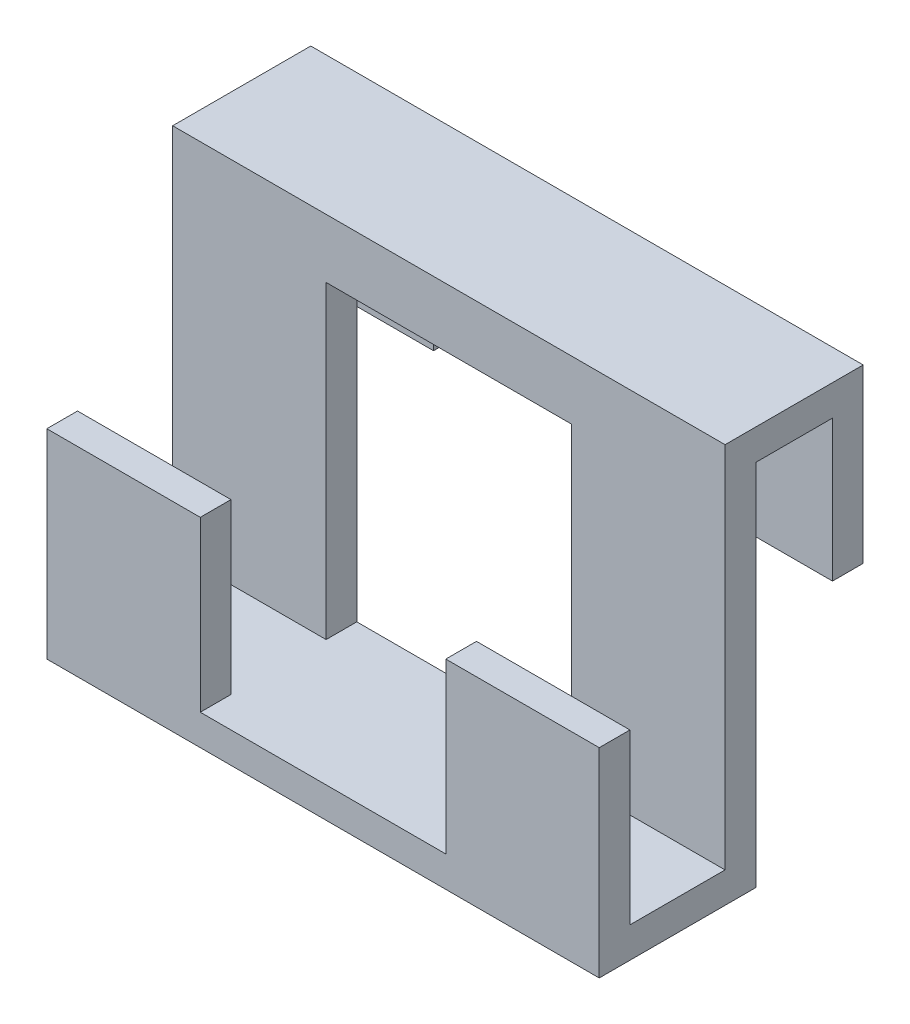
ISO-10303-21;
HEADER;
FILE_DESCRIPTION(('STEP AP214'),'2;1');
FILE_NAME('part.step','',(''),(''),'','','');
FILE_SCHEMA(('AUTOMOTIVE_DESIGN { 1 0 10303 214 1 1 1 1 }'));
ENDSEC;
DATA;
#1=APPLICATION_CONTEXT('core data for automotive mechanical design processes');
#2=APPLICATION_PROTOCOL_DEFINITION('international standard','automotive_design',2000,#1);
#3=PRODUCT_CONTEXT('',#1,'mechanical');
#4=PRODUCT('Part','Part','',(#3));
#5=PRODUCT_RELATED_PRODUCT_CATEGORY('part','',(#4));
#6=PRODUCT_DEFINITION_FORMATION('','',#4);
#7=PRODUCT_DEFINITION_CONTEXT('part definition',#1,'design');
#8=PRODUCT_DEFINITION('design','',#6,#7);
#9=PRODUCT_DEFINITION_SHAPE('','',#8);
#10=(LENGTH_UNIT() NAMED_UNIT(*) SI_UNIT(.MILLI.,.METRE.));
#11=(NAMED_UNIT(*) PLANE_ANGLE_UNIT() SI_UNIT($,.RADIAN.));
#12=(NAMED_UNIT(*) SI_UNIT($,.STERADIAN.) SOLID_ANGLE_UNIT());
#13=UNCERTAINTY_MEASURE_WITH_UNIT(LENGTH_MEASURE(1.E-05),#10,'distance_accuracy_value','');
#14=(GEOMETRIC_REPRESENTATION_CONTEXT(3) GLOBAL_UNCERTAINTY_ASSIGNED_CONTEXT((#13)) GLOBAL_UNIT_ASSIGNED_CONTEXT((#10,
#11,#12)) REPRESENTATION_CONTEXT('',''));
#15=CARTESIAN_POINT('',(0.,0.,0.));
#16=DIRECTION('',(0.,0.,1.));
#17=DIRECTION('',(1.,0.,0.));
#18=AXIS2_PLACEMENT_3D('',#15,#16,#17);
#19=CARTESIAN_POINT('',(180.,-3.93907485343079,0.));
#20=DIRECTION('',(0.,1.,0.));
#21=DIRECTION('',(0.,0.,1.));
#22=AXIS2_PLACEMENT_3D('',#19,#20,#21);
#23=PLANE('',#22);
#24=DIRECTION('',(0.,0.,1.));
#25=VECTOR('',#24,1.);
#26=CARTESIAN_POINT('',(130.,-3.93907485343079,0.));
#27=LINE('',#26,#25);
#28=CARTESIAN_POINT('',(130.,-3.93907485343079,-51.8240956037035));
#29=VERTEX_POINT('',#28);
#30=CARTESIAN_POINT('',(130.,-3.93907485343079,-41.8240956037035));
#31=VERTEX_POINT('',#30);
#32=EDGE_CURVE('E242',#29,#31,#27,.T.);
#33=ORIENTED_EDGE('',*,*,#32,.F.);
#34=DIRECTION('',(-1.,0.,0.));
#35=VECTOR('',#34,1.);
#36=CARTESIAN_POINT('',(180.,-3.93907485343079,-51.8240956037035));
#37=LINE('',#36,#35);
#38=CARTESIAN_POINT('',(180.,-3.93907485343079,-51.8240956037035));
#39=VERTEX_POINT('',#38);
#40=EDGE_CURVE('E353',#39,#29,#37,.T.);
#41=ORIENTED_EDGE('',*,*,#40,.F.);
#42=DIRECTION('',(0.,0.,-1.));
#43=VECTOR('',#42,1.);
#44=CARTESIAN_POINT('',(180.,-3.93907485343079,0.));
#45=LINE('',#44,#43);
#46=CARTESIAN_POINT('',(180.,-3.93907485343079,-41.8240956037035));
#47=VERTEX_POINT('',#46);
#48=EDGE_CURVE('E267',#47,#39,#45,.T.);
#49=ORIENTED_EDGE('',*,*,#48,.F.);
#50=DIRECTION('',(-1.,0.,0.));
#51=VECTOR('',#50,1.);
#52=CARTESIAN_POINT('',(180.,-3.93907485343079,-41.8240956037035));
#53=LINE('',#52,#51);
#54=EDGE_CURVE('E357',#47,#31,#53,.T.);
#55=ORIENTED_EDGE('',*,*,#54,.T.);
#56=EDGE_LOOP('',(#33,#41,#49,#55));
#57=FACE_BOUND('',#56,.T.);
#58=ADVANCED_FACE('F35',(#57),#23,.F.);
#59=CARTESIAN_POINT('',(180.,0.,24.1759043962965));
#60=DIRECTION('',(0.,0.,-1.));
#61=DIRECTION('',(0.,1.,0.));
#62=AXIS2_PLACEMENT_3D('',#59,#60,#61);
#63=PLANE('',#62);
#64=DIRECTION('',(-1.,0.,0.));
#65=VECTOR('',#64,1.);
#66=CARTESIAN_POINT('',(180.,-67.9390748534308,24.1759043962965));
#67=LINE('',#66,#65);
#68=CARTESIAN_POINT('',(180.,-67.9390748534308,24.1759043962965));
#69=VERTEX_POINT('',#68);
#70=CARTESIAN_POINT('',(130.,-67.9390748534308,24.1759043962965));
#71=VERTEX_POINT('',#70);
#72=EDGE_CURVE('E340',#69,#71,#67,.T.);
#73=ORIENTED_EDGE('',*,*,#72,.T.);
#74=DIRECTION('',(0.,1.,0.));
#75=VECTOR('',#74,1.);
#76=CARTESIAN_POINT('',(130.,0.,24.1759043962965));
#77=LINE('',#76,#75);
#78=CARTESIAN_POINT('',(130.,-12.9390748534308,24.1759043962965));
#79=VERTEX_POINT('',#78);
#80=EDGE_CURVE('E202',#71,#79,#77,.T.);
#81=ORIENTED_EDGE('',*,*,#80,.T.);
#82=DIRECTION('',(-1.,0.,0.));
#83=VECTOR('',#82,1.);
#84=CARTESIAN_POINT('',(180.,-12.9390748534308,24.1759043962965));
#85=LINE('',#84,#83);
#86=CARTESIAN_POINT('',(180.,-12.9390748534308,24.1759043962965));
#87=VERTEX_POINT('',#86);
#88=EDGE_CURVE('E336',#87,#79,#85,.T.);
#89=ORIENTED_EDGE('',*,*,#88,.F.);
#90=DIRECTION('',(0.,-1.,0.));
#91=VECTOR('',#90,1.);
#92=CARTESIAN_POINT('',(180.,0.,24.1759043962965));
#93=LINE('',#92,#91);
#94=EDGE_CURVE('E279',#87,#69,#93,.T.);
#95=ORIENTED_EDGE('',*,*,#94,.T.);
#96=EDGE_LOOP('',(#73,#81,#89,#95));
#97=FACE_BOUND('',#96,.T.);
#98=ADVANCED_FACE('F423',(#97),#63,.T.);
#99=CARTESIAN_POINT('',(180.,-12.9390748534308,0.));
#100=DIRECTION('',(0.,1.,0.));
#101=DIRECTION('',(0.,0.,1.));
#102=AXIS2_PLACEMENT_3D('',#99,#100,#101);
#103=PLANE('',#102);
#104=ORIENTED_EDGE('',*,*,#88,.T.);
#105=DIRECTION('',(0.,0.,1.));
#106=VECTOR('',#105,1.);
#107=CARTESIAN_POINT('',(130.,-12.9390748534308,0.));
#108=LINE('',#107,#106);
#109=CARTESIAN_POINT('',(130.,-12.9390748534308,34.1759043962966));
#110=VERTEX_POINT('',#109);
#111=EDGE_CURVE('E233',#79,#110,#108,.T.);
#112=ORIENTED_EDGE('',*,*,#111,.T.);
#113=DIRECTION('',(-1.,0.,0.));
#114=VECTOR('',#113,1.);
#115=CARTESIAN_POINT('',(180.,-12.9390748534308,34.1759043962966));
#116=LINE('',#115,#114);
#117=CARTESIAN_POINT('',(180.,-12.9390748534308,34.1759043962966));
#118=VERTEX_POINT('',#117);
#119=EDGE_CURVE('E219',#118,#110,#116,.T.);
#120=ORIENTED_EDGE('',*,*,#119,.F.);
#121=DIRECTION('',(0.,0.,-1.));
#122=VECTOR('',#121,1.);
#123=CARTESIAN_POINT('',(180.,-12.9390748534308,0.));
#124=LINE('',#123,#122);
#125=EDGE_CURVE('E282',#118,#87,#124,.T.);
#126=ORIENTED_EDGE('',*,*,#125,.T.);
#127=EDGE_LOOP('',(#104,#112,#120,#126));
#128=FACE_BOUND('',#127,.T.);
#129=ADVANCED_FACE('F421',(#128),#103,.T.);
#130=CARTESIAN_POINT('',(180.,0.,-41.8240956037035));
#131=DIRECTION('',(0.,0.,-1.));
#132=DIRECTION('',(0.,1.,0.));
#133=AXIS2_PLACEMENT_3D('',#130,#131,#132);
#134=PLANE('',#133);
#135=CARTESIAN_POINT('',(50.,-3.93907485343079,-41.8240956037035));
#136=VERTEX_POINT('',#135);
#137=CARTESIAN_POINT('',(0.,-3.93907485343079,-41.8240956037035));
#138=VERTEX_POINT('',#137);
#139=EDGE_CURVE('E356',#136,#138,#53,.T.);
#140=ORIENTED_EDGE('',*,*,#139,.F.);
#141=DIRECTION('',(0.,1.,0.));
#142=VECTOR('',#141,1.);
#143=CARTESIAN_POINT('',(50.,0.,-41.8240956037035));
#144=LINE('',#143,#142);
#145=CARTESIAN_POINT('',(50.,32.8455234998181,-41.8240956037035));
#146=VERTEX_POINT('',#145);
#147=EDGE_CURVE('E260',#136,#146,#144,.T.);
#148=ORIENTED_EDGE('',*,*,#147,.T.);
#149=DIRECTION('',(-1.,0.,0.));
#150=VECTOR('',#149,1.);
#151=CARTESIAN_POINT('',(180.,32.8455234998181,-41.8240956037035));
#152=LINE('',#151,#150);
#153=CARTESIAN_POINT('',(130.,32.8455234998181,-41.8240956037035));
#154=VERTEX_POINT('',#153);
#155=EDGE_CURVE('E248',#154,#146,#152,.T.);
#156=ORIENTED_EDGE('',*,*,#155,.F.);
#157=DIRECTION('',(0.,1.,0.));
#158=VECTOR('',#157,1.);
#159=CARTESIAN_POINT('',(130.,0.,-41.8240956037035));
#160=LINE('',#159,#158);
#161=EDGE_CURVE('E244',#31,#154,#160,.T.);
#162=ORIENTED_EDGE('',*,*,#161,.F.);
#163=ORIENTED_EDGE('',*,*,#54,.F.);
#164=DIRECTION('',(0.,-1.,0.));
#165=VECTOR('',#164,1.);
#166=CARTESIAN_POINT('',(180.,0.,-41.8240956037035));
#167=LINE('',#166,#165);
#168=CARTESIAN_POINT('',(180.,42.0609251465692,-41.8240956037035));
#169=VERTEX_POINT('',#168);
#170=EDGE_CURVE('E264',#169,#47,#167,.T.);
#171=ORIENTED_EDGE('',*,*,#170,.F.);
#172=DIRECTION('',(-1.,0.,0.));
#173=VECTOR('',#172,1.);
#174=CARTESIAN_POINT('',(180.,42.0609251465692,-41.8240956037035));
#175=LINE('',#174,#173);
#176=CARTESIAN_POINT('',(0.,42.0609251465692,-41.8240956037035));
#177=VERTEX_POINT('',#176);
#178=EDGE_CURVE('E293',#169,#177,#175,.T.);
#179=ORIENTED_EDGE('',*,*,#178,.T.);
#180=DIRECTION('',(0.,-1.,0.));
#181=VECTOR('',#180,1.);
#182=CARTESIAN_POINT('',(0.,0.,-41.8240956037035));
#183=LINE('',#182,#181);
#184=EDGE_CURVE('E263',#177,#138,#183,.T.);
#185=ORIENTED_EDGE('',*,*,#184,.T.);
#186=EDGE_LOOP('',(#140,#148,#156,#162,#163,#171,#179,#185));
#187=FACE_BOUND('',#186,.T.);
#188=ADVANCED_FACE('F37',(#187),#134,.F.);
#189=CARTESIAN_POINT('',(50.,-3.93907485343079,-51.8240956037035));
#190=VERTEX_POINT('',#189);
#191=CARTESIAN_POINT('',(0.,-3.93907485343079,-51.8240956037035));
#192=VERTEX_POINT('',#191);
#193=EDGE_CURVE('E352',#190,#192,#37,.T.);
#194=ORIENTED_EDGE('',*,*,#193,.F.);
#195=DIRECTION('',(0.,0.,1.));
#196=VECTOR('',#195,1.);
#197=CARTESIAN_POINT('',(50.,-3.93907485343079,0.));
#198=LINE('',#197,#196);
#199=EDGE_CURVE('E257',#190,#136,#198,.T.);
#200=ORIENTED_EDGE('',*,*,#199,.T.);
#201=ORIENTED_EDGE('',*,*,#139,.T.);
#202=DIRECTION('',(0.,0.,-1.));
#203=VECTOR('',#202,1.);
#204=CARTESIAN_POINT('',(0.,-3.93907485343079,0.));
#205=LINE('',#204,#203);
#206=EDGE_CURVE('E296',#138,#192,#205,.T.);
#207=ORIENTED_EDGE('',*,*,#206,.T.);
#208=EDGE_LOOP('',(#194,#200,#201,#207));
#209=FACE_BOUND('',#208,.T.);
#210=ADVANCED_FACE('F441',(#209),#23,.F.);
#211=CARTESIAN_POINT('',(180.,0.,-51.8240956037035));
#212=DIRECTION('',(0.,0.,1.));
#213=DIRECTION('',(1.,0.,0.));
#214=AXIS2_PLACEMENT_3D('',#211,#212,#213);
#215=PLANE('',#214);
#216=DIRECTION('',(1.,0.,0.));
#217=VECTOR('',#216,1.);
#218=CARTESIAN_POINT('',(50.,32.8455234998181,-51.8240956037035));
#219=LINE('',#218,#217);
#220=CARTESIAN_POINT('',(50.,32.8455234998181,-51.8240956037035));
#221=VERTEX_POINT('',#220);
#222=CARTESIAN_POINT('',(130.,32.8455234998181,-51.8240956037035));
#223=VERTEX_POINT('',#222);
#224=EDGE_CURVE('E228',#221,#223,#219,.T.);
#225=ORIENTED_EDGE('',*,*,#224,.F.);
#226=DIRECTION('',(0.,-1.,0.));
#227=VECTOR('',#226,1.);
#228=CARTESIAN_POINT('',(50.,32.8455234998181,-51.8240956037035));
#229=LINE('',#228,#227);
#230=EDGE_CURVE('E220',#221,#190,#229,.T.);
#231=ORIENTED_EDGE('',*,*,#230,.T.);
#232=ORIENTED_EDGE('',*,*,#193,.T.);
#233=DIRECTION('',(0.,1.,0.));
#234=VECTOR('',#233,1.);
#235=CARTESIAN_POINT('',(0.,0.,-51.8240956037035));
#236=LINE('',#235,#234);
#237=CARTESIAN_POINT('',(0.,52.0609251465692,-51.8240956037035));
#238=VERTEX_POINT('',#237);
#239=EDGE_CURVE('E299',#192,#238,#236,.T.);
#240=ORIENTED_EDGE('',*,*,#239,.T.);
#241=DIRECTION('',(-1.,0.,0.));
#242=VECTOR('',#241,1.);
#243=CARTESIAN_POINT('',(180.,52.0609251465692,-51.8240956037035));
#244=LINE('',#243,#242);
#245=CARTESIAN_POINT('',(180.,52.0609251465692,-51.8240956037035));
#246=VERTEX_POINT('',#245);
#247=EDGE_CURVE('E349',#246,#238,#244,.T.);
#248=ORIENTED_EDGE('',*,*,#247,.F.);
#249=DIRECTION('',(0.,1.,0.));
#250=VECTOR('',#249,1.);
#251=CARTESIAN_POINT('',(180.,0.,-51.8240956037035));
#252=LINE('',#251,#250);
#253=EDGE_CURVE('E270',#39,#246,#252,.T.);
#254=ORIENTED_EDGE('',*,*,#253,.F.);
#255=ORIENTED_EDGE('',*,*,#40,.T.);
#256=DIRECTION('',(0.,-1.,0.));
#257=VECTOR('',#256,1.);
#258=CARTESIAN_POINT('',(130.,32.8455234998181,-51.8240956037035));
#259=LINE('',#258,#257);
#260=EDGE_CURVE('E223',#223,#29,#259,.T.);
#261=ORIENTED_EDGE('',*,*,#260,.F.);
#262=EDGE_LOOP('',(#225,#231,#232,#240,#248,#254,#255,#261));
#263=FACE_BOUND('',#262,.T.);
#264=ADVANCED_FACE('F437',(#263),#215,.F.);
#265=CARTESIAN_POINT('',(180.,52.0609251465692,0.));
#266=DIRECTION('',(0.,-1.,0.));
#267=DIRECTION('',(0.,0.,-1.));
#268=AXIS2_PLACEMENT_3D('',#265,#266,#267);
#269=PLANE('',#268);
#270=DIRECTION('',(0.,0.,1.));
#271=VECTOR('',#270,1.);
#272=CARTESIAN_POINT('',(0.,52.0609251465692,0.));
#273=LINE('',#272,#271);
#274=CARTESIAN_POINT('',(0.,52.0609251465692,-6.82409560370344));
#275=VERTEX_POINT('',#274);
#276=EDGE_CURVE('E301',#238,#275,#273,.T.);
#277=ORIENTED_EDGE('',*,*,#276,.T.);
#278=DIRECTION('',(-1.,0.,0.));
#279=VECTOR('',#278,1.);
#280=CARTESIAN_POINT('',(180.,52.0609251465692,-6.82409560370344));
#281=LINE('',#280,#279);
#282=CARTESIAN_POINT('',(180.,52.0609251465692,-6.82409560370344));
#283=VERTEX_POINT('',#282);
#284=EDGE_CURVE('E346',#283,#275,#281,.T.);
#285=ORIENTED_EDGE('',*,*,#284,.F.);
#286=DIRECTION('',(0.,0.,1.));
#287=VECTOR('',#286,1.);
#288=CARTESIAN_POINT('',(180.,52.0609251465692,0.));
#289=LINE('',#288,#287);
#290=EDGE_CURVE('E272',#246,#283,#289,.T.);
#291=ORIENTED_EDGE('',*,*,#290,.F.);
#292=ORIENTED_EDGE('',*,*,#247,.T.);
#293=EDGE_LOOP('',(#277,#285,#291,#292));
#294=FACE_BOUND('',#293,.T.);
#295=ADVANCED_FACE('F432',(#294),#269,.F.);
#296=CARTESIAN_POINT('',(180.,0.,-6.82409560370345));
#297=DIRECTION('',(0.,0.,-1.));
#298=DIRECTION('',(0.,1.,0.));
#299=AXIS2_PLACEMENT_3D('',#296,#297,#298);
#300=PLANE('',#299);
#301=DIRECTION('',(-1.,0.,0.));
#302=VECTOR('',#301,1.);
#303=CARTESIAN_POINT('',(180.,-67.9390748534308,-6.82409560370346));
#304=LINE('',#303,#302);
#305=CARTESIAN_POINT('',(50.0000000000001,-67.9390748534308,-6.82409560370346));
#306=VERTEX_POINT('',#305);
#307=CARTESIAN_POINT('',(0.,-67.9390748534308,-6.82409560370346));
#308=VERTEX_POINT('',#307);
#309=EDGE_CURVE('E342',#306,#308,#304,.T.);
#310=ORIENTED_EDGE('',*,*,#309,.F.);
#311=DIRECTION('',(0.,1.,0.));
#312=VECTOR('',#311,1.);
#313=CARTESIAN_POINT('',(50.,0.,-6.82409560370345));
#314=LINE('',#313,#312);
#315=CARTESIAN_POINT('',(50.,32.8455234998181,-6.82409560370344));
#316=VERTEX_POINT('',#315);
#317=EDGE_CURVE('E254',#306,#316,#314,.T.);
#318=ORIENTED_EDGE('',*,*,#317,.T.);
#319=DIRECTION('',(-1.,0.,0.));
#320=VECTOR('',#319,1.);
#321=CARTESIAN_POINT('',(180.,32.8455234998181,-6.82409560370345));
#322=LINE('',#321,#320);
#323=CARTESIAN_POINT('',(130.,32.8455234998181,-6.82409560370345));
#324=VERTEX_POINT('',#323);
#325=EDGE_CURVE('E246',#324,#316,#322,.T.);
#326=ORIENTED_EDGE('',*,*,#325,.F.);
#327=DIRECTION('',(0.,1.,0.));
#328=VECTOR('',#327,1.);
#329=CARTESIAN_POINT('',(130.,0.,-6.82409560370345));
#330=LINE('',#329,#328);
#331=CARTESIAN_POINT('',(130.,-67.9390748534308,-6.82409560370346));
#332=VERTEX_POINT('',#331);
#333=EDGE_CURVE('E240',#332,#324,#330,.T.);
#334=ORIENTED_EDGE('',*,*,#333,.F.);
#335=CARTESIAN_POINT('',(180.,-67.9390748534308,-6.82409560370346));
#336=VERTEX_POINT('',#335);
#337=EDGE_CURVE('E343',#336,#332,#304,.T.);
#338=ORIENTED_EDGE('',*,*,#337,.F.);
#339=DIRECTION('',(0.,-1.,0.));
#340=VECTOR('',#339,1.);
#341=CARTESIAN_POINT('',(180.,0.,-6.82409560370345));
#342=LINE('',#341,#340);
#343=EDGE_CURVE('E274',#283,#336,#342,.T.);
#344=ORIENTED_EDGE('',*,*,#343,.F.);
#345=ORIENTED_EDGE('',*,*,#284,.T.);
#346=DIRECTION('',(0.,-1.,0.));
#347=VECTOR('',#346,1.);
#348=CARTESIAN_POINT('',(0.,0.,-6.82409560370345));
#349=LINE('',#348,#347);
#350=EDGE_CURVE('E303',#275,#308,#349,.T.);
#351=ORIENTED_EDGE('',*,*,#350,.T.);
#352=EDGE_LOOP('',(#310,#318,#326,#334,#338,#344,#345,#351));
#353=FACE_BOUND('',#352,.T.);
#354=ADVANCED_FACE('F384',(#353),#300,.F.);
#355=CARTESIAN_POINT('',(180.,-67.9390748534308,0.));
#356=DIRECTION('',(0.,1.,0.));
#357=DIRECTION('',(0.,0.,1.));
#358=AXIS2_PLACEMENT_3D('',#355,#356,#357);
#359=PLANE('',#358);
#360=CARTESIAN_POINT('',(50.,-67.9390748534308,24.1759043962965));
#361=VERTEX_POINT('',#360);
#362=CARTESIAN_POINT('',(0.,-67.9390748534308,24.1759043962965));
#363=VERTEX_POINT('',#362);
#364=EDGE_CURVE('E339',#361,#363,#67,.T.);
#365=ORIENTED_EDGE('',*,*,#364,.F.);
#366=DIRECTION('',(0.,0.,1.));
#367=VECTOR('',#366,1.);
#368=CARTESIAN_POINT('',(50.,-67.9390748534308,-51.8240956037035));
#369=LINE('',#368,#367);
#370=CARTESIAN_POINT('',(50.,-67.9390748534308,34.1759043962966));
#371=VERTEX_POINT('',#370);
#372=EDGE_CURVE('E210',#361,#371,#369,.T.);
#373=ORIENTED_EDGE('',*,*,#372,.T.);
#374=DIRECTION('',(1.,0.,0.));
#375=VECTOR('',#374,1.);
#376=CARTESIAN_POINT('',(50.,-67.9390748534308,34.1759043962966));
#377=LINE('',#376,#375);
#378=CARTESIAN_POINT('',(130.,-67.9390748534308,34.1759043962966));
#379=VERTEX_POINT('',#378);
#380=EDGE_CURVE('E207',#371,#379,#377,.T.);
#381=ORIENTED_EDGE('',*,*,#380,.T.);
#382=DIRECTION('',(0.,0.,1.));
#383=VECTOR('',#382,1.);
#384=CARTESIAN_POINT('',(130.,-67.9390748534308,-51.8240956037035));
#385=LINE('',#384,#383);
#386=EDGE_CURVE('E195',#71,#379,#385,.T.);
#387=ORIENTED_EDGE('',*,*,#386,.F.);
#388=ORIENTED_EDGE('',*,*,#72,.F.);
#389=DIRECTION('',(0.,0.,-1.));
#390=VECTOR('',#389,1.);
#391=CARTESIAN_POINT('',(180.,-67.9390748534308,0.));
#392=LINE('',#391,#390);
#393=EDGE_CURVE('E276',#69,#336,#392,.T.);
#394=ORIENTED_EDGE('',*,*,#393,.T.);
#395=ORIENTED_EDGE('',*,*,#337,.T.);
#396=CARTESIAN_POINT('',(130.,-67.9390748534308,-16.8240956037035));
#397=VERTEX_POINT('',#396);
#398=EDGE_CURVE('E204',#397,#332,#385,.T.);
#399=ORIENTED_EDGE('',*,*,#398,.F.);
#400=DIRECTION('',(1.,0.,0.));
#401=VECTOR('',#400,1.);
#402=CARTESIAN_POINT('',(180.,-67.9390748534308,-16.8240956037035));
#403=LINE('',#402,#401);
#404=CARTESIAN_POINT('',(50.,-67.9390748534308,-16.8240956037035));
#405=VERTEX_POINT('',#404);
#406=EDGE_CURVE('E360',#405,#397,#403,.T.);
#407=ORIENTED_EDGE('',*,*,#406,.F.);
#408=EDGE_CURVE('E58',#405,#306,#369,.T.);
#409=ORIENTED_EDGE('',*,*,#408,.T.);
#410=ORIENTED_EDGE('',*,*,#309,.T.);
#411=DIRECTION('',(0.,0.,-1.));
#412=VECTOR('',#411,1.);
#413=CARTESIAN_POINT('',(0.,-67.9390748534308,0.));
#414=LINE('',#413,#412);
#415=EDGE_CURVE('E306',#363,#308,#414,.T.);
#416=ORIENTED_EDGE('',*,*,#415,.F.);
#417=EDGE_LOOP('',(#365,#373,#381,#387,#388,#394,#395,#399,#407,#409,#410,#416));
#418=FACE_BOUND('',#417,.T.);
#419=ADVANCED_FACE('F209',(#418),#359,.T.);
#420=DIRECTION('',(0.,1.,0.));
#421=VECTOR('',#420,1.);
#422=CARTESIAN_POINT('',(50.,0.,24.1759043962965));
#423=LINE('',#422,#421);
#424=CARTESIAN_POINT('',(50.,-12.9390748534308,24.1759043962965));
#425=VERTEX_POINT('',#424);
#426=EDGE_CURVE('E252',#361,#425,#423,.T.);
#427=ORIENTED_EDGE('',*,*,#426,.F.);
#428=ORIENTED_EDGE('',*,*,#364,.T.);
#429=DIRECTION('',(0.,-1.,0.));
#430=VECTOR('',#429,1.);
#431=CARTESIAN_POINT('',(0.,0.,24.1759043962965));
#432=LINE('',#431,#430);
#433=CARTESIAN_POINT('',(0.,-12.9390748534308,24.1759043962965));
#434=VERTEX_POINT('',#433);
#435=EDGE_CURVE('E309',#434,#363,#432,.T.);
#436=ORIENTED_EDGE('',*,*,#435,.F.);
#437=EDGE_CURVE('E335',#425,#434,#85,.T.);
#438=ORIENTED_EDGE('',*,*,#437,.F.);
#439=EDGE_LOOP('',(#427,#428,#436,#438));
#440=FACE_BOUND('',#439,.T.);
#441=ADVANCED_FACE('F395',(#440),#63,.T.);
#442=DIRECTION('',(0.,0.,1.));
#443=VECTOR('',#442,1.);
#444=CARTESIAN_POINT('',(50.,-12.9390748534308,0.));
#445=LINE('',#444,#443);
#446=CARTESIAN_POINT('',(50.,-12.9390748534308,34.1759043962966));
#447=VERTEX_POINT('',#446);
#448=EDGE_CURVE('E250',#425,#447,#445,.T.);
#449=ORIENTED_EDGE('',*,*,#448,.F.);
#450=ORIENTED_EDGE('',*,*,#437,.T.);
#451=DIRECTION('',(0.,0.,-1.));
#452=VECTOR('',#451,1.);
#453=CARTESIAN_POINT('',(0.,-12.9390748534308,0.));
#454=LINE('',#453,#452);
#455=CARTESIAN_POINT('',(0.,-12.9390748534308,34.1759043962966));
#456=VERTEX_POINT('',#455);
#457=EDGE_CURVE('E312',#456,#434,#454,.T.);
#458=ORIENTED_EDGE('',*,*,#457,.F.);
#459=EDGE_CURVE('E333',#447,#456,#116,.T.);
#460=ORIENTED_EDGE('',*,*,#459,.F.);
#461=EDGE_LOOP('',(#449,#450,#458,#460));
#462=FACE_BOUND('',#461,.T.);
#463=ADVANCED_FACE('F401',(#462),#103,.T.);
#464=CARTESIAN_POINT('',(180.,0.,34.1759043962966));
#465=DIRECTION('',(0.,0.,1.));
#466=DIRECTION('',(1.,0.,0.));
#467=AXIS2_PLACEMENT_3D('',#464,#465,#466);
#468=PLANE('',#467);
#469=DIRECTION('',(0.,-1.,0.));
#470=VECTOR('',#469,1.);
#471=CARTESIAN_POINT('',(50.,32.8455234998181,34.1759043962966));
#472=LINE('',#471,#470);
#473=EDGE_CURVE('E214',#447,#371,#472,.T.);
#474=ORIENTED_EDGE('',*,*,#473,.F.);
#475=ORIENTED_EDGE('',*,*,#459,.T.);
#476=DIRECTION('',(0.,1.,0.));
#477=VECTOR('',#476,1.);
#478=CARTESIAN_POINT('',(0.,0.,34.1759043962966));
#479=LINE('',#478,#477);
#480=CARTESIAN_POINT('',(0.,-77.9390748534308,34.1759043962966));
#481=VERTEX_POINT('',#480);
#482=EDGE_CURVE('E315',#481,#456,#479,.T.);
#483=ORIENTED_EDGE('',*,*,#482,.F.);
#484=DIRECTION('',(-1.,0.,0.));
#485=VECTOR('',#484,1.);
#486=CARTESIAN_POINT('',(180.,-77.9390748534308,34.1759043962966));
#487=LINE('',#486,#485);
#488=CARTESIAN_POINT('',(180.,-77.9390748534308,34.1759043962966));
#489=VERTEX_POINT('',#488);
#490=EDGE_CURVE('E331',#489,#481,#487,.T.);
#491=ORIENTED_EDGE('',*,*,#490,.F.);
#492=DIRECTION('',(0.,1.,0.));
#493=VECTOR('',#492,1.);
#494=CARTESIAN_POINT('',(180.,0.,34.1759043962966));
#495=LINE('',#494,#493);
#496=EDGE_CURVE('E285',#489,#118,#495,.T.);
#497=ORIENTED_EDGE('',*,*,#496,.T.);
#498=ORIENTED_EDGE('',*,*,#119,.T.);
#499=DIRECTION('',(0.,-1.,0.));
#500=VECTOR('',#499,1.);
#501=CARTESIAN_POINT('',(130.,32.8455234998181,34.1759043962966));
#502=LINE('',#501,#500);
#503=EDGE_CURVE('E199',#110,#379,#502,.T.);
#504=ORIENTED_EDGE('',*,*,#503,.T.);
#505=ORIENTED_EDGE('',*,*,#380,.F.);
#506=EDGE_LOOP('',(#474,#475,#483,#491,#497,#498,#504,#505));
#507=FACE_BOUND('',#506,.T.);
#508=ADVANCED_FACE('F217',(#507),#468,.T.);
#509=CARTESIAN_POINT('',(180.,-77.9390748534308,0.));
#510=DIRECTION('',(0.,1.,0.));
#511=DIRECTION('',(0.,0.,1.));
#512=AXIS2_PLACEMENT_3D('',#509,#510,#511);
#513=PLANE('',#512);
#514=DIRECTION('',(0.,0.,-1.));
#515=VECTOR('',#514,1.);
#516=CARTESIAN_POINT('',(0.,-77.9390748534308,0.));
#517=LINE('',#516,#515);
#518=CARTESIAN_POINT('',(0.,-77.9390748534308,-16.8240956037035));
#519=VERTEX_POINT('',#518);
#520=EDGE_CURVE('E318',#481,#519,#517,.T.);
#521=ORIENTED_EDGE('',*,*,#520,.T.);
#522=DIRECTION('',(-1.,0.,0.));
#523=VECTOR('',#522,1.);
#524=CARTESIAN_POINT('',(180.,-77.9390748534308,-16.8240956037035));
#525=LINE('',#524,#523);
#526=CARTESIAN_POINT('',(180.,-77.9390748534308,-16.8240956037035));
#527=VERTEX_POINT('',#526);
#528=EDGE_CURVE('E328',#527,#519,#525,.T.);
#529=ORIENTED_EDGE('',*,*,#528,.F.);
#530=DIRECTION('',(0.,0.,-1.));
#531=VECTOR('',#530,1.);
#532=CARTESIAN_POINT('',(180.,-77.9390748534308,0.));
#533=LINE('',#532,#531);
#534=EDGE_CURVE('E287',#489,#527,#533,.T.);
#535=ORIENTED_EDGE('',*,*,#534,.F.);
#536=ORIENTED_EDGE('',*,*,#490,.T.);
#537=EDGE_LOOP('',(#521,#529,#535,#536));
#538=FACE_BOUND('',#537,.T.);
#539=ADVANCED_FACE('F409',(#538),#513,.F.);
#540=CARTESIAN_POINT('',(180.,0.,-16.8240956037035));
#541=DIRECTION('',(0.,0.,1.));
#542=DIRECTION('',(1.,0.,0.));
#543=AXIS2_PLACEMENT_3D('',#540,#541,#542);
#544=PLANE('',#543);
#545=DIRECTION('',(1.,0.,0.));
#546=VECTOR('',#545,1.);
#547=CARTESIAN_POINT('',(180.,32.8455234998181,-16.8240956037035));
#548=LINE('',#547,#546);
#549=CARTESIAN_POINT('',(50.,32.8455234998181,-16.8240956037035));
#550=VERTEX_POINT('',#549);
#551=CARTESIAN_POINT('',(130.,32.8455234998181,-16.8240956037035));
#552=VERTEX_POINT('',#551);
#553=EDGE_CURVE('E43',#550,#552,#548,.T.);
#554=ORIENTED_EDGE('',*,*,#553,.F.);
#555=DIRECTION('',(0.,-1.,0.));
#556=VECTOR('',#555,1.);
#557=CARTESIAN_POINT('',(50.,0.,-16.8240956037035));
#558=LINE('',#557,#556);
#559=EDGE_CURVE('E11',#550,#405,#558,.T.);
#560=ORIENTED_EDGE('',*,*,#559,.T.);
#561=ORIENTED_EDGE('',*,*,#406,.T.);
#562=DIRECTION('',(0.,-1.,0.));
#563=VECTOR('',#562,1.);
#564=CARTESIAN_POINT('',(130.,0.,-16.8240956037035));
#565=LINE('',#564,#563);
#566=EDGE_CURVE('E363',#552,#397,#565,.T.);
#567=ORIENTED_EDGE('',*,*,#566,.F.);
#568=EDGE_LOOP('',(#554,#560,#561,#567));
#569=FACE_BOUND('',#568,.T.);
#570=DIRECTION('',(0.,1.,0.));
#571=VECTOR('',#570,1.);
#572=CARTESIAN_POINT('',(0.,0.,-16.8240956037035));
#573=LINE('',#572,#571);
#574=CARTESIAN_POINT('',(0.,42.0609251465692,-16.8240956037035));
#575=VERTEX_POINT('',#574);
#576=EDGE_CURVE('E320',#519,#575,#573,.T.);
#577=ORIENTED_EDGE('',*,*,#576,.T.);
#578=DIRECTION('',(-1.,0.,0.));
#579=VECTOR('',#578,1.);
#580=CARTESIAN_POINT('',(180.,42.0609251465692,-16.8240956037035));
#581=LINE('',#580,#579);
#582=CARTESIAN_POINT('',(180.,42.0609251465692,-16.8240956037035));
#583=VERTEX_POINT('',#582);
#584=EDGE_CURVE('E325',#583,#575,#581,.T.);
#585=ORIENTED_EDGE('',*,*,#584,.F.);
#586=DIRECTION('',(0.,1.,0.));
#587=VECTOR('',#586,1.);
#588=CARTESIAN_POINT('',(180.,0.,-16.8240956037035));
#589=LINE('',#588,#587);
#590=EDGE_CURVE('E289',#527,#583,#589,.T.);
#591=ORIENTED_EDGE('',*,*,#590,.F.);
#592=ORIENTED_EDGE('',*,*,#528,.T.);
#593=EDGE_LOOP('',(#577,#585,#591,#592));
#594=FACE_BOUND('',#593,.T.);
#595=ADVANCED_FACE('F378',(#569,#594),#544,.F.);
#596=CARTESIAN_POINT('',(180.,42.0609251465692,0.));
#597=DIRECTION('',(0.,1.,0.));
#598=DIRECTION('',(0.,0.,1.));
#599=AXIS2_PLACEMENT_3D('',#596,#597,#598);
#600=PLANE('',#599);
#601=DIRECTION('',(0.,0.,-1.));
#602=VECTOR('',#601,1.);
#603=CARTESIAN_POINT('',(0.,42.0609251465692,0.));
#604=LINE('',#603,#602);
#605=EDGE_CURVE('E268',#575,#177,#604,.T.);
#606=ORIENTED_EDGE('',*,*,#605,.T.);
#607=ORIENTED_EDGE('',*,*,#178,.F.);
#608=DIRECTION('',(0.,0.,-1.));
#609=VECTOR('',#608,1.);
#610=CARTESIAN_POINT('',(180.,42.0609251465692,0.));
#611=LINE('',#610,#609);
#612=EDGE_CURVE('E291',#583,#169,#611,.T.);
#613=ORIENTED_EDGE('',*,*,#612,.F.);
#614=ORIENTED_EDGE('',*,*,#584,.T.);
#615=EDGE_LOOP('',(#606,#607,#613,#614));
#616=FACE_BOUND('',#615,.T.);
#617=ADVANCED_FACE('F447',(#616),#600,.F.);
#618=CARTESIAN_POINT('',(180.,0.,0.));
#619=DIRECTION('',(1.,0.,0.));
#620=DIRECTION('',(0.,0.,-1.));
#621=AXIS2_PLACEMENT_3D('',#618,#619,#620);
#622=PLANE('',#621);
#623=ORIENTED_EDGE('',*,*,#170,.T.);
#624=ORIENTED_EDGE('',*,*,#48,.T.);
#625=ORIENTED_EDGE('',*,*,#253,.T.);
#626=ORIENTED_EDGE('',*,*,#290,.T.);
#627=ORIENTED_EDGE('',*,*,#343,.T.);
#628=ORIENTED_EDGE('',*,*,#393,.F.);
#629=ORIENTED_EDGE('',*,*,#94,.F.);
#630=ORIENTED_EDGE('',*,*,#125,.F.);
#631=ORIENTED_EDGE('',*,*,#496,.F.);
#632=ORIENTED_EDGE('',*,*,#534,.T.);
#633=ORIENTED_EDGE('',*,*,#590,.T.);
#634=ORIENTED_EDGE('',*,*,#612,.T.);
#635=EDGE_LOOP('',(#623,#624,#625,#626,#627,#628,#629,#630,#631,#632,#633,#634));
#636=FACE_BOUND('',#635,.T.);
#637=ADVANCED_FACE('F414',(#636),#622,.T.);
#638=CARTESIAN_POINT('',(0.,0.,0.));
#639=DIRECTION('',(1.,0.,0.));
#640=DIRECTION('',(0.,0.,-1.));
#641=AXIS2_PLACEMENT_3D('',#638,#639,#640);
#642=PLANE('',#641);
#643=ORIENTED_EDGE('',*,*,#184,.F.);
#644=ORIENTED_EDGE('',*,*,#605,.F.);
#645=ORIENTED_EDGE('',*,*,#576,.F.);
#646=ORIENTED_EDGE('',*,*,#520,.F.);
#647=ORIENTED_EDGE('',*,*,#482,.T.);
#648=ORIENTED_EDGE('',*,*,#457,.T.);
#649=ORIENTED_EDGE('',*,*,#435,.T.);
#650=ORIENTED_EDGE('',*,*,#415,.T.);
#651=ORIENTED_EDGE('',*,*,#350,.F.);
#652=ORIENTED_EDGE('',*,*,#276,.F.);
#653=ORIENTED_EDGE('',*,*,#239,.F.);
#654=ORIENTED_EDGE('',*,*,#206,.F.);
#655=EDGE_LOOP('',(#643,#644,#645,#646,#647,#648,#649,#650,#651,#652,#653,#654));
#656=FACE_BOUND('',#655,.T.);
#657=ADVANCED_FACE('F390',(#656),#642,.F.);
#658=CARTESIAN_POINT('',(130.,32.8455234998181,-51.8240956037035));
#659=DIRECTION('',(-1.,0.,0.));
#660=DIRECTION('',(0.,0.,1.));
#661=AXIS2_PLACEMENT_3D('',#658,#659,#660);
#662=PLANE('',#661);
#663=ORIENTED_EDGE('',*,*,#333,.T.);
#664=DIRECTION('',(0.,0.,1.));
#665=VECTOR('',#664,1.);
#666=CARTESIAN_POINT('',(130.,32.8455234998181,-51.8240956037035));
#667=LINE('',#666,#665);
#668=EDGE_CURVE('E235',#552,#324,#667,.T.);
#669=ORIENTED_EDGE('',*,*,#668,.F.);
#670=ORIENTED_EDGE('',*,*,#566,.T.);
#671=ORIENTED_EDGE('',*,*,#398,.T.);
#672=EDGE_LOOP('',(#663,#669,#670,#671));
#673=FACE_BOUND('',#672,.T.);
#674=ADVANCED_FACE('F376',(#673),#662,.T.);
#675=CARTESIAN_POINT('',(50.,32.8455234998181,-51.8240956037035));
#676=DIRECTION('',(0.,-1.,0.));
#677=DIRECTION('',(0.,0.,-1.));
#678=AXIS2_PLACEMENT_3D('',#675,#676,#677);
#679=PLANE('',#678);
#680=ORIENTED_EDGE('',*,*,#325,.T.);
#681=DIRECTION('',(0.,0.,1.));
#682=VECTOR('',#681,1.);
#683=CARTESIAN_POINT('',(50.,32.8455234998181,-51.8240956037035));
#684=LINE('',#683,#682);
#685=EDGE_CURVE('E234',#550,#316,#684,.T.);
#686=ORIENTED_EDGE('',*,*,#685,.F.);
#687=ORIENTED_EDGE('',*,*,#553,.T.);
#688=ORIENTED_EDGE('',*,*,#668,.T.);
#689=EDGE_LOOP('',(#680,#686,#687,#688));
#690=FACE_BOUND('',#689,.T.);
#691=ADVANCED_FACE('F370',(#690),#679,.T.);
#692=CARTESIAN_POINT('',(50.,32.8455234998181,-51.8240956037035));
#693=DIRECTION('',(-1.,0.,0.));
#694=DIRECTION('',(0.,-1.,0.));
#695=AXIS2_PLACEMENT_3D('',#692,#693,#694);
#696=PLANE('',#695);
#697=ORIENTED_EDGE('',*,*,#408,.F.);
#698=ORIENTED_EDGE('',*,*,#559,.F.);
#699=ORIENTED_EDGE('',*,*,#685,.T.);
#700=ORIENTED_EDGE('',*,*,#317,.F.);
#701=EDGE_LOOP('',(#697,#698,#699,#700));
#702=FACE_BOUND('',#701,.T.);
#703=ADVANCED_FACE('F381',(#702),#696,.F.);
#704=ORIENTED_EDGE('',*,*,#386,.T.);
#705=ORIENTED_EDGE('',*,*,#503,.F.);
#706=ORIENTED_EDGE('',*,*,#111,.F.);
#707=ORIENTED_EDGE('',*,*,#80,.F.);
#708=EDGE_LOOP('',(#704,#705,#706,#707));
#709=FACE_BOUND('',#708,.T.);
#710=ADVANCED_FACE('F197',(#709),#662,.T.);
#711=ORIENTED_EDGE('',*,*,#426,.T.);
#712=ORIENTED_EDGE('',*,*,#448,.T.);
#713=ORIENTED_EDGE('',*,*,#473,.T.);
#714=ORIENTED_EDGE('',*,*,#372,.F.);
#715=EDGE_LOOP('',(#711,#712,#713,#714));
#716=FACE_BOUND('',#715,.T.);
#717=ADVANCED_FACE('F398',(#716),#696,.F.);
#718=ORIENTED_EDGE('',*,*,#199,.F.);
#719=ORIENTED_EDGE('',*,*,#230,.F.);
#720=EDGE_CURVE('E230',#221,#146,#684,.T.);
#721=ORIENTED_EDGE('',*,*,#720,.T.);
#722=ORIENTED_EDGE('',*,*,#147,.F.);
#723=EDGE_LOOP('',(#718,#719,#721,#722));
#724=FACE_BOUND('',#723,.T.);
#725=ADVANCED_FACE('F558',(#724),#696,.F.);
#726=ORIENTED_EDGE('',*,*,#155,.T.);
#727=ORIENTED_EDGE('',*,*,#720,.F.);
#728=ORIENTED_EDGE('',*,*,#224,.T.);
#729=EDGE_CURVE('E50',#223,#154,#667,.T.);
#730=ORIENTED_EDGE('',*,*,#729,.T.);
#731=EDGE_LOOP('',(#726,#727,#728,#730));
#732=FACE_BOUND('',#731,.T.);
#733=ADVANCED_FACE('F549',(#732),#679,.T.);
#734=ORIENTED_EDGE('',*,*,#161,.T.);
#735=ORIENTED_EDGE('',*,*,#729,.F.);
#736=ORIENTED_EDGE('',*,*,#260,.T.);
#737=ORIENTED_EDGE('',*,*,#32,.T.);
#738=EDGE_LOOP('',(#734,#735,#736,#737));
#739=FACE_BOUND('',#738,.T.);
#740=ADVANCED_FACE('F539',(#739),#662,.T.);
#741=CLOSED_SHELL('',(#58,#98,#129,#188,#210,#264,#295,#354,#419,#441,#463,#508,#539,#595,#617,
#637,#657,#674,#691,#703,#710,#717,#725,#733,#740));
#742=MANIFOLD_SOLID_BREP('B2',#741);
#743=ADVANCED_BREP_SHAPE_REPRESENTATION('',(#18,#742),#14);
#744=SHAPE_DEFINITION_REPRESENTATION(#9,#743);
ENDSEC;
END-ISO-10303-21;
